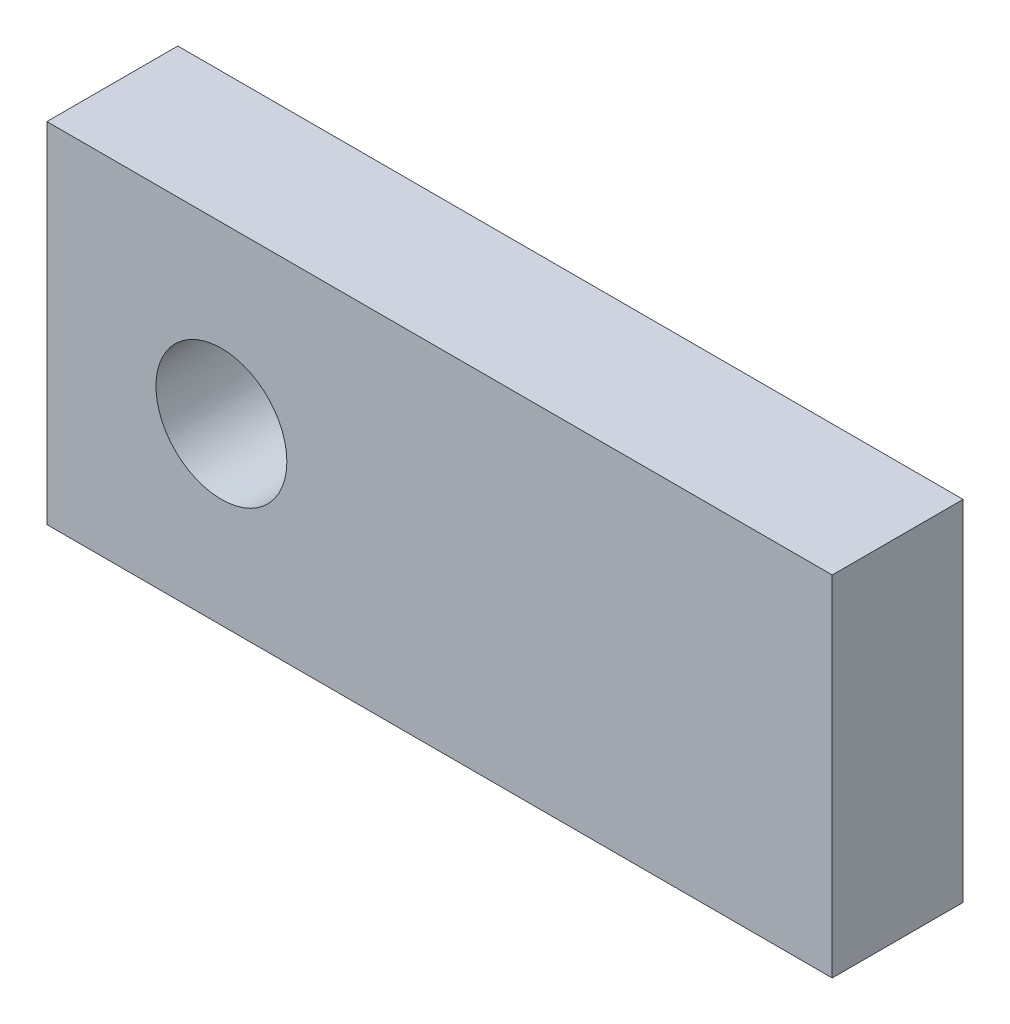
ISO-10303-21;
HEADER;
FILE_DESCRIPTION(('STEP AP214'),'2;1');
FILE_NAME('part.step','',(''),(''),'','','');
FILE_SCHEMA(('AUTOMOTIVE_DESIGN { 1 0 10303 214 1 1 1 1 }'));
ENDSEC;
DATA;
#1=APPLICATION_CONTEXT('core data for automotive mechanical design processes');
#2=APPLICATION_PROTOCOL_DEFINITION('international standard','automotive_design',2000,#1);
#3=PRODUCT_CONTEXT('',#1,'mechanical');
#4=PRODUCT('Part','Part','',(#3));
#5=PRODUCT_RELATED_PRODUCT_CATEGORY('part','',(#4));
#6=PRODUCT_DEFINITION_FORMATION('','',#4);
#7=PRODUCT_DEFINITION_CONTEXT('part definition',#1,'design');
#8=PRODUCT_DEFINITION('design','',#6,#7);
#9=PRODUCT_DEFINITION_SHAPE('','',#8);
#10=(LENGTH_UNIT() NAMED_UNIT(*) SI_UNIT(.MILLI.,.METRE.));
#11=(NAMED_UNIT(*) PLANE_ANGLE_UNIT() SI_UNIT($,.RADIAN.));
#12=(NAMED_UNIT(*) SI_UNIT($,.STERADIAN.) SOLID_ANGLE_UNIT());
#13=UNCERTAINTY_MEASURE_WITH_UNIT(LENGTH_MEASURE(1.E-05),#10,'distance_accuracy_value','');
#14=(GEOMETRIC_REPRESENTATION_CONTEXT(3) GLOBAL_UNCERTAINTY_ASSIGNED_CONTEXT((#13)) GLOBAL_UNIT_ASSIGNED_CONTEXT((#10,
#11,#12)) REPRESENTATION_CONTEXT('',''));
#15=CARTESIAN_POINT('',(0.,0.,0.));
#16=DIRECTION('',(0.,0.,1.));
#17=DIRECTION('',(1.,0.,0.));
#18=AXIS2_PLACEMENT_3D('',#15,#16,#17);
#19=CARTESIAN_POINT('',(0.,0.,3.));
#20=DIRECTION('',(1.,0.,0.));
#21=DIRECTION('',(0.,1.,0.));
#22=AXIS2_PLACEMENT_3D('',#19,#20,#21);
#23=PLANE('',#22);
#24=DIRECTION('',(0.,-1.,0.));
#25=VECTOR('',#24,1.);
#26=CARTESIAN_POINT('',(0.,0.,0.));
#27=LINE('',#26,#25);
#28=CARTESIAN_POINT('',(0.,8.,0.));
#29=VERTEX_POINT('',#28);
#30=CARTESIAN_POINT('',(0.,0.,0.));
#31=VERTEX_POINT('',#30);
#32=EDGE_CURVE('E98',#29,#31,#27,.T.);
#33=ORIENTED_EDGE('',*,*,#32,.T.);
#34=DIRECTION('',(0.,0.,-1.));
#35=VECTOR('',#34,1.);
#36=CARTESIAN_POINT('',(0.,0.,3.));
#37=LINE('',#36,#35);
#38=CARTESIAN_POINT('',(0.,0.,3.));
#39=VERTEX_POINT('',#38);
#40=EDGE_CURVE('E11',#39,#31,#37,.T.);
#41=ORIENTED_EDGE('',*,*,#40,.F.);
#42=DIRECTION('',(0.,-1.,0.));
#43=VECTOR('',#42,1.);
#44=CARTESIAN_POINT('',(0.,0.,3.));
#45=LINE('',#44,#43);
#46=CARTESIAN_POINT('',(0.,8.,3.));
#47=VERTEX_POINT('',#46);
#48=EDGE_CURVE('E86',#47,#39,#45,.T.);
#49=ORIENTED_EDGE('',*,*,#48,.F.);
#50=DIRECTION('',(0.,0.,-1.));
#51=VECTOR('',#50,1.);
#52=CARTESIAN_POINT('',(0.,8.,3.));
#53=LINE('',#52,#51);
#54=EDGE_CURVE('E94',#47,#29,#53,.T.);
#55=ORIENTED_EDGE('',*,*,#54,.T.);
#56=EDGE_LOOP('',(#33,#41,#49,#55));
#57=FACE_BOUND('',#56,.T.);
#58=ADVANCED_FACE('F35',(#57),#23,.F.);
#59=CARTESIAN_POINT('',(0.,0.,3.));
#60=DIRECTION('',(0.,1.,0.));
#61=DIRECTION('',(-1.,0.,0.));
#62=AXIS2_PLACEMENT_3D('',#59,#60,#61);
#63=PLANE('',#62);
#64=DIRECTION('',(1.,0.,0.));
#65=VECTOR('',#64,1.);
#66=CARTESIAN_POINT('',(0.,0.,0.));
#67=LINE('',#66,#65);
#68=CARTESIAN_POINT('',(18.,0.,0.));
#69=VERTEX_POINT('',#68);
#70=EDGE_CURVE('E90',#31,#69,#67,.T.);
#71=ORIENTED_EDGE('',*,*,#70,.T.);
#72=DIRECTION('',(0.,0.,-1.));
#73=VECTOR('',#72,1.);
#74=CARTESIAN_POINT('',(18.,0.,3.));
#75=LINE('',#74,#73);
#76=CARTESIAN_POINT('',(18.,0.,3.));
#77=VERTEX_POINT('',#76);
#78=EDGE_CURVE('E43',#77,#69,#75,.T.);
#79=ORIENTED_EDGE('',*,*,#78,.F.);
#80=DIRECTION('',(1.,0.,0.));
#81=VECTOR('',#80,1.);
#82=CARTESIAN_POINT('',(0.,0.,3.));
#83=LINE('',#82,#81);
#84=EDGE_CURVE('E81',#39,#77,#83,.T.);
#85=ORIENTED_EDGE('',*,*,#84,.F.);
#86=ORIENTED_EDGE('',*,*,#40,.T.);
#87=EDGE_LOOP('',(#71,#79,#85,#86));
#88=FACE_BOUND('',#87,.T.);
#89=ADVANCED_FACE('F89',(#88),#63,.F.);
#90=CARTESIAN_POINT('',(18.,0.,3.));
#91=DIRECTION('',(-1.,0.,0.));
#92=DIRECTION('',(0.,0.,1.));
#93=AXIS2_PLACEMENT_3D('',#90,#91,#92);
#94=PLANE('',#93);
#95=DIRECTION('',(0.,1.,0.));
#96=VECTOR('',#95,1.);
#97=CARTESIAN_POINT('',(18.,0.,0.));
#98=LINE('',#97,#96);
#99=CARTESIAN_POINT('',(18.,8.,0.));
#100=VERTEX_POINT('',#99);
#101=EDGE_CURVE('E68',#69,#100,#98,.T.);
#102=ORIENTED_EDGE('',*,*,#101,.T.);
#103=DIRECTION('',(0.,0.,-1.));
#104=VECTOR('',#103,1.);
#105=CARTESIAN_POINT('',(18.,8.,3.));
#106=LINE('',#105,#104);
#107=CARTESIAN_POINT('',(18.,8.,3.));
#108=VERTEX_POINT('',#107);
#109=EDGE_CURVE('E91',#108,#100,#106,.T.);
#110=ORIENTED_EDGE('',*,*,#109,.F.);
#111=DIRECTION('',(0.,1.,0.));
#112=VECTOR('',#111,1.);
#113=CARTESIAN_POINT('',(18.,0.,3.));
#114=LINE('',#113,#112);
#115=EDGE_CURVE('E84',#77,#108,#114,.T.);
#116=ORIENTED_EDGE('',*,*,#115,.F.);
#117=ORIENTED_EDGE('',*,*,#78,.T.);
#118=EDGE_LOOP('',(#102,#110,#116,#117));
#119=FACE_BOUND('',#118,.T.);
#120=ADVANCED_FACE('F92',(#119),#94,.F.);
#121=CARTESIAN_POINT('',(0.,8.,3.));
#122=DIRECTION('',(0.,-1.,0.));
#123=DIRECTION('',(1.,0.,0.));
#124=AXIS2_PLACEMENT_3D('',#121,#122,#123);
#125=PLANE('',#124);
#126=DIRECTION('',(-1.,0.,0.));
#127=VECTOR('',#126,1.);
#128=CARTESIAN_POINT('',(0.,8.,0.));
#129=LINE('',#128,#127);
#130=EDGE_CURVE('E74',#100,#29,#129,.T.);
#131=ORIENTED_EDGE('',*,*,#130,.T.);
#132=ORIENTED_EDGE('',*,*,#54,.F.);
#133=DIRECTION('',(-1.,0.,0.));
#134=VECTOR('',#133,1.);
#135=CARTESIAN_POINT('',(0.,8.,3.));
#136=LINE('',#135,#134);
#137=EDGE_CURVE('E51',#108,#47,#136,.T.);
#138=ORIENTED_EDGE('',*,*,#137,.F.);
#139=ORIENTED_EDGE('',*,*,#109,.T.);
#140=EDGE_LOOP('',(#131,#132,#138,#139));
#141=FACE_BOUND('',#140,.T.);
#142=ADVANCED_FACE('F106',(#141),#125,.F.);
#143=CARTESIAN_POINT('',(0.,0.,3.));
#144=DIRECTION('',(0.,0.,-1.));
#145=DIRECTION('',(-1.,0.,0.));
#146=AXIS2_PLACEMENT_3D('',#143,#144,#145);
#147=PLANE('',#146);
#148=CARTESIAN_POINT('',(4.,4.,3.));
#149=DIRECTION('',(0.,0.,1.));
#150=DIRECTION('',(1.,0.,0.));
#151=AXIS2_PLACEMENT_3D('',#148,#149,#150);
#152=CIRCLE('',#151,1.5);
#153=CARTESIAN_POINT('',(5.5,4.,3.));
#154=VERTEX_POINT('',#153);
#155=EDGE_CURVE('E112',#154,#154,#152,.T.);
#156=ORIENTED_EDGE('',*,*,#155,.F.);
#157=EDGE_LOOP('',(#156));
#158=FACE_BOUND('',#157,.T.);
#159=ORIENTED_EDGE('',*,*,#48,.T.);
#160=ORIENTED_EDGE('',*,*,#84,.T.);
#161=ORIENTED_EDGE('',*,*,#115,.T.);
#162=ORIENTED_EDGE('',*,*,#137,.T.);
#163=EDGE_LOOP('',(#159,#160,#161,#162));
#164=FACE_BOUND('',#163,.T.);
#165=ADVANCED_FACE('F82',(#158,#164),#147,.F.);
#166=CARTESIAN_POINT('',(0.,0.,0.));
#167=DIRECTION('',(0.,0.,-1.));
#168=DIRECTION('',(-1.,0.,0.));
#169=AXIS2_PLACEMENT_3D('',#166,#167,#168);
#170=PLANE('',#169);
#171=CARTESIAN_POINT('',(4.,4.,0.));
#172=DIRECTION('',(0.,0.,1.));
#173=DIRECTION('',(1.,0.,0.));
#174=AXIS2_PLACEMENT_3D('',#171,#172,#173);
#175=CIRCLE('',#174,1.5);
#176=CARTESIAN_POINT('',(5.5,4.,0.));
#177=VERTEX_POINT('',#176);
#178=EDGE_CURVE('E101',#177,#177,#175,.T.);
#179=ORIENTED_EDGE('',*,*,#178,.T.);
#180=EDGE_LOOP('',(#179));
#181=FACE_BOUND('',#180,.T.);
#182=ORIENTED_EDGE('',*,*,#32,.F.);
#183=ORIENTED_EDGE('',*,*,#130,.F.);
#184=ORIENTED_EDGE('',*,*,#101,.F.);
#185=ORIENTED_EDGE('',*,*,#70,.F.);
#186=EDGE_LOOP('',(#182,#183,#184,#185));
#187=FACE_BOUND('',#186,.T.);
#188=ADVANCED_FACE('F109',(#181,#187),#170,.T.);
#189=CARTESIAN_POINT('',(4.,4.,0.));
#190=DIRECTION('',(0.,0.,1.));
#191=DIRECTION('',(1.,0.,0.));
#192=AXIS2_PLACEMENT_3D('',#189,#190,#191);
#193=CYLINDRICAL_SURFACE('',#192,1.5);
#194=ORIENTED_EDGE('',*,*,#178,.F.);
#195=EDGE_LOOP('',(#194));
#196=FACE_BOUND('',#195,.T.);
#197=ORIENTED_EDGE('',*,*,#155,.T.);
#198=EDGE_LOOP('',(#197));
#199=FACE_BOUND('',#198,.T.);
#200=ADVANCED_FACE('F119',(#196,#199),#193,.F.);
#201=CLOSED_SHELL('',(#58,#89,#120,#142,#165,#188,#200));
#202=MANIFOLD_SOLID_BREP('B2',#201);
#203=ADVANCED_BREP_SHAPE_REPRESENTATION('',(#18,#202),#14);
#204=SHAPE_DEFINITION_REPRESENTATION(#9,#203);
ENDSEC;
END-ISO-10303-21;
